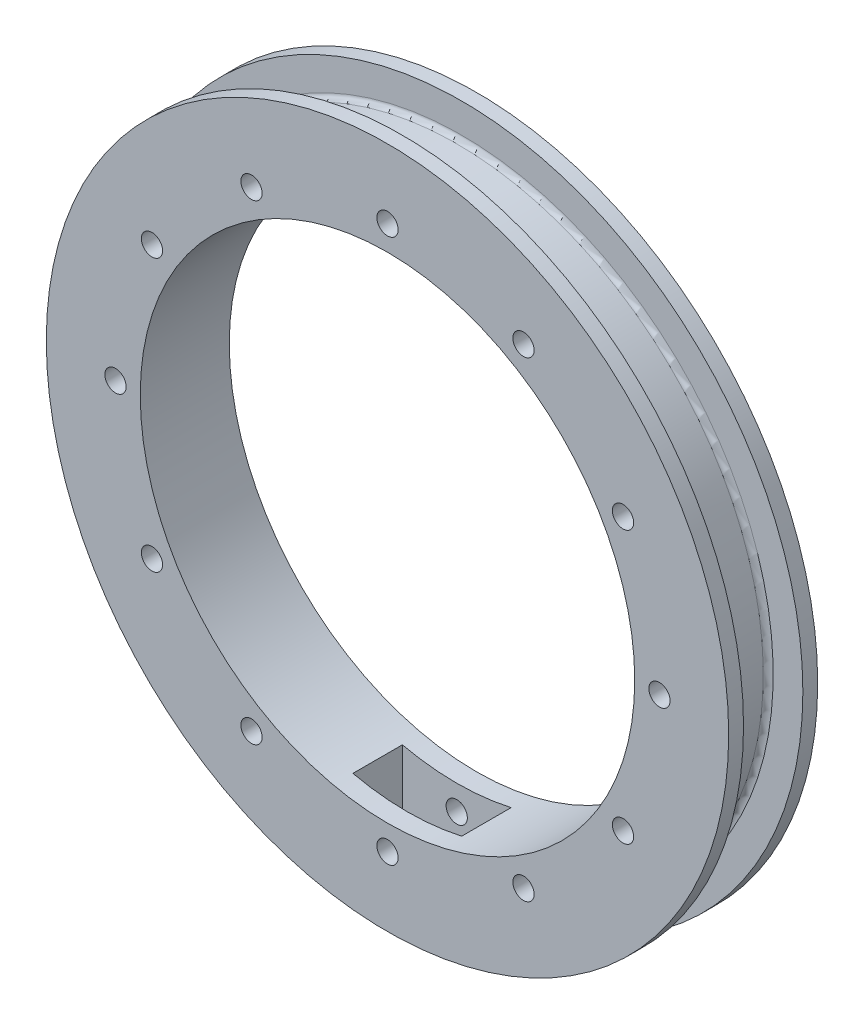
ISO-10303-21;
HEADER;
FILE_DESCRIPTION(('STEP AP214'),'2;1');
FILE_NAME('part.step','',(''),(''),'','','');
FILE_SCHEMA(('AUTOMOTIVE_DESIGN { 1 0 10303 214 1 1 1 1 }'));
ENDSEC;
DATA;
#1=APPLICATION_CONTEXT('core data for automotive mechanical design processes');
#2=APPLICATION_PROTOCOL_DEFINITION('international standard','automotive_design',2000,#1);
#3=PRODUCT_CONTEXT('',#1,'mechanical');
#4=PRODUCT('Part','Part','',(#3));
#5=PRODUCT_RELATED_PRODUCT_CATEGORY('part','',(#4));
#6=PRODUCT_DEFINITION_FORMATION('','',#4);
#7=PRODUCT_DEFINITION_CONTEXT('part definition',#1,'design');
#8=PRODUCT_DEFINITION('design','',#6,#7);
#9=PRODUCT_DEFINITION_SHAPE('','',#8);
#10=(LENGTH_UNIT() NAMED_UNIT(*) SI_UNIT(.MILLI.,.METRE.));
#11=(NAMED_UNIT(*) PLANE_ANGLE_UNIT() SI_UNIT($,.RADIAN.));
#12=(NAMED_UNIT(*) SI_UNIT($,.STERADIAN.) SOLID_ANGLE_UNIT());
#13=UNCERTAINTY_MEASURE_WITH_UNIT(LENGTH_MEASURE(1.E-05),#10,'distance_accuracy_value','');
#14=(GEOMETRIC_REPRESENTATION_CONTEXT(3) GLOBAL_UNCERTAINTY_ASSIGNED_CONTEXT((#13)) GLOBAL_UNIT_ASSIGNED_CONTEXT((#10,
#11,#12)) REPRESENTATION_CONTEXT('',''));
#15=CARTESIAN_POINT('',(0.,0.,0.));
#16=DIRECTION('',(0.,0.,1.));
#17=DIRECTION('',(1.,0.,0.));
#18=AXIS2_PLACEMENT_3D('',#15,#16,#17);
#19=CARTESIAN_POINT('',(0.,0.,6.));
#20=DIRECTION('',(0.,0.,-1.));
#21=DIRECTION('',(-1.,0.,0.));
#22=AXIS2_PLACEMENT_3D('',#19,#20,#21);
#23=CYLINDRICAL_SURFACE('',#22,62.);
#24=CARTESIAN_POINT('',(0.,0.,-5.));
#25=DIRECTION('',(0.,0.,-1.));
#26=DIRECTION('',(-1.,0.,0.));
#27=AXIS2_PLACEMENT_3D('',#24,#25,#26);
#28=CIRCLE('',#27,62.);
#29=CARTESIAN_POINT('',(11.,-61.0163912402973,-5.));
#30=VERTEX_POINT('',#29);
#31=CARTESIAN_POINT('',(-11.,-61.0163912403872,-5.));
#32=VERTEX_POINT('',#31);
#33=EDGE_CURVE('E118',#30,#32,#28,.F.);
#34=ORIENTED_EDGE('',*,*,#33,.T.);
#35=DIRECTION('',(0.,0.,-1.));
#36=VECTOR('',#35,1.);
#37=CARTESIAN_POINT('',(-11.,-61.0163912403872,6.));
#38=LINE('',#37,#36);
#39=CARTESIAN_POINT('',(-11.,-61.0163912403872,5.));
#40=VERTEX_POINT('',#39);
#41=EDGE_CURVE('E102',#32,#40,#38,.F.);
#42=ORIENTED_EDGE('',*,*,#41,.T.);
#43=CARTESIAN_POINT('',(0.,0.,5.));
#44=DIRECTION('',(0.,0.,1.));
#45=DIRECTION('',(1.,0.,0.));
#46=AXIS2_PLACEMENT_3D('',#43,#44,#45);
#47=CIRCLE('',#46,62.);
#48=CARTESIAN_POINT('',(11.,-61.0163912403872,5.));
#49=VERTEX_POINT('',#48);
#50=EDGE_CURVE('E114',#40,#49,#47,.F.);
#51=ORIENTED_EDGE('',*,*,#50,.T.);
#52=DIRECTION('',(0.,0.,-1.));
#53=VECTOR('',#52,1.);
#54=CARTESIAN_POINT('',(11.,-61.0163912403872,6.));
#55=LINE('',#54,#53);
#56=EDGE_CURVE('E99',#49,#30,#55,.T.);
#57=ORIENTED_EDGE('',*,*,#56,.T.);
#58=EDGE_LOOP('',(#34,#42,#51,#57));
#59=FACE_BOUND('',#58,.T.);
#60=ADVANCED_FACE('F34',(#59),#23,.T.);
#61=CARTESIAN_POINT('',(0.,0.,-9.));
#62=DIRECTION('',(0.,0.,1.));
#63=DIRECTION('',(1.,0.,0.));
#64=AXIS2_PLACEMENT_3D('',#61,#62,#63);
#65=CYLINDRICAL_SURFACE('',#64,69.);
#66=CARTESIAN_POINT('',(0.,0.,-9.));
#67=DIRECTION('',(0.,0.,-1.));
#68=DIRECTION('',(-1.,0.,0.));
#69=AXIS2_PLACEMENT_3D('',#66,#67,#68);
#70=CIRCLE('',#69,69.);
#71=CARTESIAN_POINT('',(-69.,0.,-9.));
#72=VERTEX_POINT('',#71);
#73=EDGE_CURVE('E111',#72,#72,#70,.T.);
#74=ORIENTED_EDGE('',*,*,#73,.F.);
#75=EDGE_LOOP('',(#74));
#76=FACE_BOUND('',#75,.T.);
#77=CARTESIAN_POINT('',(0.,0.,-6.));
#78=DIRECTION('',(0.,0.,-1.));
#79=DIRECTION('',(-1.,0.,0.));
#80=AXIS2_PLACEMENT_3D('',#77,#78,#79);
#81=CIRCLE('',#80,69.);
#82=CARTESIAN_POINT('',(-69.,0.,-6.));
#83=VERTEX_POINT('',#82);
#84=EDGE_CURVE('E108',#83,#83,#81,.T.);
#85=ORIENTED_EDGE('',*,*,#84,.T.);
#86=EDGE_LOOP('',(#85));
#87=FACE_BOUND('',#86,.T.);
#88=ADVANCED_FACE('F203',(#76,#87),#65,.T.);
#89=CARTESIAN_POINT('',(0.,0.,-9.));
#90=DIRECTION('',(0.,0.,-1.));
#91=DIRECTION('',(-1.,0.,0.));
#92=AXIS2_PLACEMENT_3D('',#89,#90,#91);
#93=PLANE('',#92);
#94=CARTESIAN_POINT('',(0.,55.,-9.));
#95=DIRECTION('',(0.,0.,-1.));
#96=DIRECTION('',(-1.,0.,0.));
#97=AXIS2_PLACEMENT_3D('',#94,#95,#96);
#98=CIRCLE('',#97,2.15);
#99=CARTESIAN_POINT('',(-2.15,55.,-9.));
#100=VERTEX_POINT('',#99);
#101=EDGE_CURVE('E130',#100,#100,#98,.T.);
#102=ORIENTED_EDGE('',*,*,#101,.F.);
#103=EDGE_LOOP('',(#102));
#104=FACE_BOUND('',#103,.T.);
#105=CARTESIAN_POINT('',(27.4999999999997,47.6313972081429,-9.));
#106=DIRECTION('',(0.,0.,-1.));
#107=DIRECTION('',(-1.,0.,0.));
#108=AXIS2_PLACEMENT_3D('',#105,#106,#107);
#109=CIRCLE('',#108,2.15000000000135);
#110=CARTESIAN_POINT('',(25.3499999999984,47.6313972081429,-9.));
#111=VERTEX_POINT('',#110);
#112=EDGE_CURVE('E302',#111,#111,#109,.T.);
#113=ORIENTED_EDGE('',*,*,#112,.F.);
#114=EDGE_LOOP('',(#113));
#115=FACE_BOUND('',#114,.T.);
#116=CARTESIAN_POINT('',(47.631397208143,27.4999999999979,-9.));
#117=DIRECTION('',(0.,0.,-1.));
#118=DIRECTION('',(-1.,0.,0.));
#119=AXIS2_PLACEMENT_3D('',#116,#117,#118);
#120=CIRCLE('',#119,2.15000000000237);
#121=CARTESIAN_POINT('',(45.4813972081406,27.4999999999979,-9.));
#122=VERTEX_POINT('',#121);
#123=EDGE_CURVE('E299',#122,#122,#120,.T.);
#124=ORIENTED_EDGE('',*,*,#123,.F.);
#125=EDGE_LOOP('',(#124));
#126=FACE_BOUND('',#125,.T.);
#127=CARTESIAN_POINT('',(54.9999999999977,-2.34142324931068E-12,-9.));
#128=DIRECTION('',(0.,0.,-1.));
#129=DIRECTION('',(-1.,0.,0.));
#130=AXIS2_PLACEMENT_3D('',#127,#128,#129);
#131=CIRCLE('',#130,2.15000000000347);
#132=CARTESIAN_POINT('',(52.8499999999942,-2.34142324931068E-12,-9.));
#133=VERTEX_POINT('',#132);
#134=EDGE_CURVE('E295',#133,#133,#131,.T.);
#135=ORIENTED_EDGE('',*,*,#134,.F.);
#136=EDGE_LOOP('',(#135));
#137=FACE_BOUND('',#136,.T.);
#138=CARTESIAN_POINT('',(-27.5000000000001,47.6313972081441,-9.));
#139=DIRECTION('',(0.,0.,-1.));
#140=DIRECTION('',(-1.,0.,0.));
#141=AXIS2_PLACEMENT_3D('',#138,#139,#140);
#142=CIRCLE('',#141,2.15);
#143=CARTESIAN_POINT('',(-29.6500000000001,47.6313972081441,-9.));
#144=VERTEX_POINT('',#143);
#145=EDGE_CURVE('E289',#144,#144,#142,.T.);
#146=ORIENTED_EDGE('',*,*,#145,.F.);
#147=EDGE_LOOP('',(#146));
#148=FACE_BOUND('',#147,.T.);
#149=CARTESIAN_POINT('',(-47.6313972081453,27.500000000002,-9.));
#150=DIRECTION('',(0.,0.,-1.));
#151=DIRECTION('',(-1.,0.,0.));
#152=AXIS2_PLACEMENT_3D('',#149,#150,#151);
#153=CIRCLE('',#152,2.15000000000064);
#154=CARTESIAN_POINT('',(-49.7813972081459,27.500000000002,-9.));
#155=VERTEX_POINT('',#154);
#156=EDGE_CURVE('E292',#155,#155,#153,.T.);
#157=ORIENTED_EDGE('',*,*,#156,.F.);
#158=EDGE_LOOP('',(#157));
#159=FACE_BOUND('',#158,.T.);
#160=CARTESIAN_POINT('',(-55.0000000000023,2.33468769191537E-12,-9.));
#161=DIRECTION('',(0.,0.,-1.));
#162=DIRECTION('',(-1.,0.,0.));
#163=AXIS2_PLACEMENT_3D('',#160,#161,#162);
#164=CIRCLE('',#163,2.15000000000173);
#165=CARTESIAN_POINT('',(-57.1500000000041,2.33468769191537E-12,-9.));
#166=VERTEX_POINT('',#165);
#167=EDGE_CURVE('E319',#166,#166,#164,.T.);
#168=ORIENTED_EDGE('',*,*,#167,.F.);
#169=EDGE_LOOP('',(#168));
#170=FACE_BOUND('',#169,.T.);
#171=CARTESIAN_POINT('',(-47.6313972081476,-27.499999999998,-9.));
#172=DIRECTION('',(0.,0.,-1.));
#173=DIRECTION('',(-1.,0.,0.));
#174=AXIS2_PLACEMENT_3D('',#171,#172,#173);
#175=CIRCLE('',#174,2.15000000000301);
#176=CARTESIAN_POINT('',(-49.7813972081506,-27.499999999998,-9.));
#177=VERTEX_POINT('',#176);
#178=EDGE_CURVE('E308',#177,#177,#175,.T.);
#179=ORIENTED_EDGE('',*,*,#178,.F.);
#180=EDGE_LOOP('',(#179));
#181=FACE_BOUND('',#180,.T.);
#182=CARTESIAN_POINT('',(-27.5000000000044,-47.6313972081429,-9.));
#183=DIRECTION('',(0.,0.,-1.));
#184=DIRECTION('',(-1.,0.,0.));
#185=AXIS2_PLACEMENT_3D('',#182,#183,#184);
#186=CIRCLE('',#185,2.15000000000414);
#187=CARTESIAN_POINT('',(-29.6500000000085,-47.6313972081429,-9.));
#188=VERTEX_POINT('',#187);
#189=EDGE_CURVE('E305',#188,#188,#186,.T.);
#190=ORIENTED_EDGE('',*,*,#189,.F.);
#191=EDGE_LOOP('',(#190));
#192=FACE_BOUND('',#191,.T.);
#193=CARTESIAN_POINT('',(-4.66937538383073E-12,-55.,-9.));
#194=DIRECTION('',(0.,0.,-1.));
#195=DIRECTION('',(-1.,0.,0.));
#196=AXIS2_PLACEMENT_3D('',#193,#194,#195);
#197=CIRCLE('',#196,2.15000000000483);
#198=CARTESIAN_POINT('',(-2.1500000000095,-55.,-9.));
#199=VERTEX_POINT('',#198);
#200=EDGE_CURVE('E309',#199,#199,#197,.T.);
#201=ORIENTED_EDGE('',*,*,#200,.F.);
#202=EDGE_LOOP('',(#201));
#203=FACE_BOUND('',#202,.T.);
#204=CARTESIAN_POINT('',(27.4999999999956,-47.6313972081453,-9.));
#205=DIRECTION('',(0.,0.,-1.));
#206=DIRECTION('',(-1.,0.,0.));
#207=AXIS2_PLACEMENT_3D('',#204,#205,#206);
#208=CIRCLE('',#207,2.15000000000495);
#209=CARTESIAN_POINT('',(25.3499999999907,-47.6313972081453,-9.));
#210=VERTEX_POINT('',#209);
#211=EDGE_CURVE('E312',#210,#210,#208,.T.);
#212=ORIENTED_EDGE('',*,*,#211,.F.);
#213=EDGE_LOOP('',(#212));
#214=FACE_BOUND('',#213,.T.);
#215=CARTESIAN_POINT('',(47.6313972081406,-27.500000000002,-9.));
#216=DIRECTION('',(0.,0.,-1.));
#217=DIRECTION('',(-1.,0.,0.));
#218=AXIS2_PLACEMENT_3D('',#215,#216,#217);
#219=CIRCLE('',#218,2.15000000000445);
#220=CARTESIAN_POINT('',(45.4813972081362,-27.500000000002,-9.));
#221=VERTEX_POINT('',#220);
#222=EDGE_CURVE('E298',#221,#221,#219,.T.);
#223=ORIENTED_EDGE('',*,*,#222,.F.);
#224=EDGE_LOOP('',(#223));
#225=FACE_BOUND('',#224,.T.);
#226=CARTESIAN_POINT('',(0.,0.,-9.));
#227=DIRECTION('',(0.,0.,-1.));
#228=DIRECTION('',(-1.,0.,0.));
#229=AXIS2_PLACEMENT_3D('',#226,#227,#228);
#230=CIRCLE('',#229,50.);
#231=CARTESIAN_POINT('',(-50.,0.,-9.));
#232=VERTEX_POINT('',#231);
#233=EDGE_CURVE('E163',#232,#232,#230,.T.);
#234=ORIENTED_EDGE('',*,*,#233,.F.);
#235=EDGE_LOOP('',(#234));
#236=FACE_BOUND('',#235,.T.);
#237=ORIENTED_EDGE('',*,*,#73,.T.);
#238=EDGE_LOOP('',(#237));
#239=FACE_BOUND('',#238,.T.);
#240=ADVANCED_FACE('F207',(#104,#115,#126,#137,#148,#159,#170,#181,#192,#203,#214,#225,#236,
#239),#93,.T.);
#241=CARTESIAN_POINT('',(0.,0.,-6.));
#242=DIRECTION('',(0.,0.,-1.));
#243=DIRECTION('',(-1.,0.,0.));
#244=AXIS2_PLACEMENT_3D('',#241,#242,#243);
#245=PLANE('',#244);
#246=CARTESIAN_POINT('',(0.,0.,-6.));
#247=DIRECTION('',(0.,0.,-1.));
#248=DIRECTION('',(-1.,0.,0.));
#249=AXIS2_PLACEMENT_3D('',#246,#247,#248);
#250=CIRCLE('',#249,63.);
#251=CARTESIAN_POINT('',(-63.,0.,-6.));
#252=VERTEX_POINT('',#251);
#253=EDGE_CURVE('E121',#252,#252,#250,.T.);
#254=ORIENTED_EDGE('',*,*,#253,.T.);
#255=EDGE_LOOP('',(#254));
#256=FACE_BOUND('',#255,.T.);
#257=ORIENTED_EDGE('',*,*,#84,.F.);
#258=EDGE_LOOP('',(#257));
#259=FACE_BOUND('',#258,.T.);
#260=ADVANCED_FACE('F211',(#256,#259),#245,.F.);
#261=CARTESIAN_POINT('',(0.,0.,9.));
#262=DIRECTION('',(0.,0.,-1.));
#263=DIRECTION('',(-1.,0.,0.));
#264=AXIS2_PLACEMENT_3D('',#261,#262,#263);
#265=CYLINDRICAL_SURFACE('',#264,69.);
#266=CARTESIAN_POINT('',(0.,0.,9.));
#267=DIRECTION('',(0.,0.,1.));
#268=DIRECTION('',(1.,0.,0.));
#269=AXIS2_PLACEMENT_3D('',#266,#267,#268);
#270=CIRCLE('',#269,69.);
#271=CARTESIAN_POINT('',(69.,0.,9.));
#272=VERTEX_POINT('',#271);
#273=EDGE_CURVE('E105',#272,#272,#270,.T.);
#274=ORIENTED_EDGE('',*,*,#273,.F.);
#275=EDGE_LOOP('',(#274));
#276=FACE_BOUND('',#275,.T.);
#277=CARTESIAN_POINT('',(0.,0.,6.));
#278=DIRECTION('',(0.,0.,1.));
#279=DIRECTION('',(1.,0.,0.));
#280=AXIS2_PLACEMENT_3D('',#277,#278,#279);
#281=CIRCLE('',#280,69.);
#282=CARTESIAN_POINT('',(69.,0.,6.));
#283=VERTEX_POINT('',#282);
#284=EDGE_CURVE('E104',#283,#283,#281,.T.);
#285=ORIENTED_EDGE('',*,*,#284,.T.);
#286=EDGE_LOOP('',(#285));
#287=FACE_BOUND('',#286,.T.);
#288=ADVANCED_FACE('F214',(#276,#287),#265,.T.);
#289=CARTESIAN_POINT('',(0.,0.,9.));
#290=DIRECTION('',(0.,0.,1.));
#291=DIRECTION('',(1.,0.,0.));
#292=AXIS2_PLACEMENT_3D('',#289,#290,#291);
#293=PLANE('',#292);
#294=CARTESIAN_POINT('',(0.,55.,9.00000000000001));
#295=DIRECTION('',(0.,0.,1.));
#296=DIRECTION('',(1.,0.,0.));
#297=AXIS2_PLACEMENT_3D('',#294,#295,#296);
#298=CIRCLE('',#297,2.15);
#299=CARTESIAN_POINT('',(2.15,55.,9.00000000000001));
#300=VERTEX_POINT('',#299);
#301=EDGE_CURVE('E38',#300,#300,#298,.T.);
#302=ORIENTED_EDGE('',*,*,#301,.F.);
#303=EDGE_LOOP('',(#302));
#304=FACE_BOUND('',#303,.T.);
#305=CARTESIAN_POINT('',(27.4999999999997,47.6313972081429,9.00000000000001));
#306=DIRECTION('',(0.,0.,1.));
#307=DIRECTION('',(1.,0.,0.));
#308=AXIS2_PLACEMENT_3D('',#305,#306,#307);
#309=CIRCLE('',#308,2.15000000000135);
#310=CARTESIAN_POINT('',(29.6500000000011,47.6313972081429,9.00000000000001));
#311=VERTEX_POINT('',#310);
#312=EDGE_CURVE('E158',#311,#311,#309,.T.);
#313=ORIENTED_EDGE('',*,*,#312,.F.);
#314=EDGE_LOOP('',(#313));
#315=FACE_BOUND('',#314,.T.);
#316=CARTESIAN_POINT('',(47.631397208143,27.4999999999979,9.00000000000001));
#317=DIRECTION('',(0.,0.,1.));
#318=DIRECTION('',(1.,0.,0.));
#319=AXIS2_PLACEMENT_3D('',#316,#317,#318);
#320=CIRCLE('',#319,2.15000000000237);
#321=CARTESIAN_POINT('',(49.7813972081453,27.4999999999979,9.00000000000001));
#322=VERTEX_POINT('',#321);
#323=EDGE_CURVE('E156',#322,#322,#320,.T.);
#324=ORIENTED_EDGE('',*,*,#323,.F.);
#325=EDGE_LOOP('',(#324));
#326=FACE_BOUND('',#325,.T.);
#327=CARTESIAN_POINT('',(54.9999999999977,-2.34142324931068E-12,9.00000000000001));
#328=DIRECTION('',(0.,0.,1.));
#329=DIRECTION('',(1.,0.,0.));
#330=AXIS2_PLACEMENT_3D('',#327,#328,#329);
#331=CIRCLE('',#330,2.15000000000347);
#332=CARTESIAN_POINT('',(57.1500000000011,-2.34142324931068E-12,9.00000000000001));
#333=VERTEX_POINT('',#332);
#334=EDGE_CURVE('E153',#333,#333,#331,.T.);
#335=ORIENTED_EDGE('',*,*,#334,.F.);
#336=EDGE_LOOP('',(#335));
#337=FACE_BOUND('',#336,.T.);
#338=CARTESIAN_POINT('',(-27.5000000000001,47.6313972081441,9.00000000000001));
#339=DIRECTION('',(0.,0.,1.));
#340=DIRECTION('',(1.,0.,0.));
#341=AXIS2_PLACEMENT_3D('',#338,#339,#340);
#342=CIRCLE('',#341,2.15);
#343=CARTESIAN_POINT('',(-25.3500000000001,47.6313972081441,9.00000000000001));
#344=VERTEX_POINT('',#343);
#345=EDGE_CURVE('E150',#344,#344,#342,.T.);
#346=ORIENTED_EDGE('',*,*,#345,.F.);
#347=EDGE_LOOP('',(#346));
#348=FACE_BOUND('',#347,.T.);
#349=CARTESIAN_POINT('',(-47.6313972081453,27.500000000002,9.00000000000001));
#350=DIRECTION('',(0.,0.,1.));
#351=DIRECTION('',(1.,0.,0.));
#352=AXIS2_PLACEMENT_3D('',#349,#350,#351);
#353=CIRCLE('',#352,2.15000000000064);
#354=CARTESIAN_POINT('',(-45.4813972081447,27.500000000002,9.00000000000001));
#355=VERTEX_POINT('',#354);
#356=EDGE_CURVE('E147',#355,#355,#353,.T.);
#357=ORIENTED_EDGE('',*,*,#356,.F.);
#358=EDGE_LOOP('',(#357));
#359=FACE_BOUND('',#358,.T.);
#360=CARTESIAN_POINT('',(-55.0000000000023,2.33468769191537E-12,9.00000000000001));
#361=DIRECTION('',(0.,0.,1.));
#362=DIRECTION('',(1.,0.,0.));
#363=AXIS2_PLACEMENT_3D('',#360,#361,#362);
#364=CIRCLE('',#363,2.15000000000173);
#365=CARTESIAN_POINT('',(-52.8500000000006,2.33468769191537E-12,9.00000000000001));
#366=VERTEX_POINT('',#365);
#367=EDGE_CURVE('E144',#366,#366,#364,.T.);
#368=ORIENTED_EDGE('',*,*,#367,.F.);
#369=EDGE_LOOP('',(#368));
#370=FACE_BOUND('',#369,.T.);
#371=CARTESIAN_POINT('',(-47.6313972081476,-27.499999999998,9.00000000000001));
#372=DIRECTION('',(0.,0.,1.));
#373=DIRECTION('',(1.,0.,0.));
#374=AXIS2_PLACEMENT_3D('',#371,#372,#373);
#375=CIRCLE('',#374,2.15000000000301);
#376=CARTESIAN_POINT('',(-45.4813972081446,-27.499999999998,9.00000000000001));
#377=VERTEX_POINT('',#376);
#378=EDGE_CURVE('E141',#377,#377,#375,.T.);
#379=ORIENTED_EDGE('',*,*,#378,.F.);
#380=EDGE_LOOP('',(#379));
#381=FACE_BOUND('',#380,.T.);
#382=CARTESIAN_POINT('',(-27.5000000000044,-47.6313972081429,9.00000000000001));
#383=DIRECTION('',(0.,0.,1.));
#384=DIRECTION('',(1.,0.,0.));
#385=AXIS2_PLACEMENT_3D('',#382,#383,#384);
#386=CIRCLE('',#385,2.15000000000414);
#387=CARTESIAN_POINT('',(-25.3500000000002,-47.6313972081429,9.00000000000001));
#388=VERTEX_POINT('',#387);
#389=EDGE_CURVE('E138',#388,#388,#386,.T.);
#390=ORIENTED_EDGE('',*,*,#389,.F.);
#391=EDGE_LOOP('',(#390));
#392=FACE_BOUND('',#391,.T.);
#393=CARTESIAN_POINT('',(-4.66937538383073E-12,-55.,9.00000000000001));
#394=DIRECTION('',(0.,0.,1.));
#395=DIRECTION('',(1.,0.,0.));
#396=AXIS2_PLACEMENT_3D('',#393,#394,#395);
#397=CIRCLE('',#396,2.15000000000483);
#398=CARTESIAN_POINT('',(2.15000000000016,-55.,9.00000000000001));
#399=VERTEX_POINT('',#398);
#400=EDGE_CURVE('E135',#399,#399,#397,.T.);
#401=ORIENTED_EDGE('',*,*,#400,.F.);
#402=EDGE_LOOP('',(#401));
#403=FACE_BOUND('',#402,.T.);
#404=CARTESIAN_POINT('',(27.4999999999956,-47.6313972081453,9.00000000000001));
#405=DIRECTION('',(0.,0.,1.));
#406=DIRECTION('',(1.,0.,0.));
#407=AXIS2_PLACEMENT_3D('',#404,#405,#406);
#408=CIRCLE('',#407,2.15000000000495);
#409=CARTESIAN_POINT('',(29.6500000000006,-47.6313972081453,9.00000000000001));
#410=VERTEX_POINT('',#409);
#411=EDGE_CURVE('E134',#410,#410,#408,.T.);
#412=ORIENTED_EDGE('',*,*,#411,.F.);
#413=EDGE_LOOP('',(#412));
#414=FACE_BOUND('',#413,.T.);
#415=CARTESIAN_POINT('',(47.6313972081406,-27.500000000002,9.00000000000001));
#416=DIRECTION('',(0.,0.,1.));
#417=DIRECTION('',(1.,0.,0.));
#418=AXIS2_PLACEMENT_3D('',#415,#416,#417);
#419=CIRCLE('',#418,2.15000000000445);
#420=CARTESIAN_POINT('',(49.7813972081451,-27.500000000002,9.00000000000001));
#421=VERTEX_POINT('',#420);
#422=EDGE_CURVE('E131',#421,#421,#419,.T.);
#423=ORIENTED_EDGE('',*,*,#422,.F.);
#424=EDGE_LOOP('',(#423));
#425=FACE_BOUND('',#424,.T.);
#426=CARTESIAN_POINT('',(0.,0.,9.00000000000001));
#427=DIRECTION('',(0.,0.,1.));
#428=DIRECTION('',(1.,0.,0.));
#429=AXIS2_PLACEMENT_3D('',#426,#427,#428);
#430=CIRCLE('',#429,50.);
#431=CARTESIAN_POINT('',(50.,0.,9.00000000000001));
#432=VERTEX_POINT('',#431);
#433=EDGE_CURVE('E91',#432,#432,#430,.T.);
#434=ORIENTED_EDGE('',*,*,#433,.F.);
#435=EDGE_LOOP('',(#434));
#436=FACE_BOUND('',#435,.T.);
#437=ORIENTED_EDGE('',*,*,#273,.T.);
#438=EDGE_LOOP('',(#437));
#439=FACE_BOUND('',#438,.T.);
#440=ADVANCED_FACE('F197',(#304,#315,#326,#337,#348,#359,#370,#381,#392,#403,#414,#425,#436,
#439),#293,.T.);
#441=CARTESIAN_POINT('',(0.,0.,6.));
#442=DIRECTION('',(0.,0.,1.));
#443=DIRECTION('',(1.,0.,0.));
#444=AXIS2_PLACEMENT_3D('',#441,#442,#443);
#445=PLANE('',#444);
#446=CARTESIAN_POINT('',(0.,0.,6.));
#447=DIRECTION('',(0.,0.,1.));
#448=DIRECTION('',(1.,0.,0.));
#449=AXIS2_PLACEMENT_3D('',#446,#447,#448);
#450=CIRCLE('',#449,63.);
#451=CARTESIAN_POINT('',(63.,0.,6.));
#452=VERTEX_POINT('',#451);
#453=EDGE_CURVE('E43',#452,#452,#450,.T.);
#454=ORIENTED_EDGE('',*,*,#453,.T.);
#455=EDGE_LOOP('',(#454));
#456=FACE_BOUND('',#455,.T.);
#457=ORIENTED_EDGE('',*,*,#284,.F.);
#458=EDGE_LOOP('',(#457));
#459=FACE_BOUND('',#458,.T.);
#460=ADVANCED_FACE('F190',(#456,#459),#445,.F.);
#461=CARTESIAN_POINT('',(0.,0.,-5.));
#462=DIRECTION('',(0.,0.,-1.));
#463=DIRECTION('',(-1.,0.,0.));
#464=AXIS2_PLACEMENT_3D('',#461,#462,#463);
#465=TOROIDAL_SURFACE('',#464,63.,1.);
#466=ORIENTED_EDGE('',*,*,#253,.F.);
#467=EDGE_LOOP('',(#466));
#468=FACE_BOUND('',#467,.T.);
#469=EDGE_CURVE('E119',#32,#30,#28,.F.);
#470=ORIENTED_EDGE('',*,*,#469,.F.);
#471=ORIENTED_EDGE('',*,*,#33,.F.);
#472=EDGE_LOOP('',(#470,#471));
#473=FACE_BOUND('',#472,.T.);
#474=ADVANCED_FACE('F188',(#468,#473),#465,.F.);
#475=CARTESIAN_POINT('',(0.,0.,5.));
#476=DIRECTION('',(0.,0.,1.));
#477=DIRECTION('',(1.,0.,0.));
#478=AXIS2_PLACEMENT_3D('',#475,#476,#477);
#479=TOROIDAL_SURFACE('',#478,63.,1.);
#480=EDGE_CURVE('E90',#49,#40,#47,.F.);
#481=ORIENTED_EDGE('',*,*,#480,.F.);
#482=ORIENTED_EDGE('',*,*,#50,.F.);
#483=EDGE_LOOP('',(#481,#482));
#484=FACE_BOUND('',#483,.T.);
#485=ORIENTED_EDGE('',*,*,#453,.F.);
#486=EDGE_LOOP('',(#485));
#487=FACE_BOUND('',#486,.T.);
#488=ADVANCED_FACE('F36',(#484,#487),#479,.F.);
#489=CARTESIAN_POINT('',(11.,-133.,-5.));
#490=DIRECTION('',(0.,0.,-1.));
#491=DIRECTION('',(-1.,0.,0.));
#492=AXIS2_PLACEMENT_3D('',#489,#490,#491);
#493=PLANE('',#492);
#494=CARTESIAN_POINT('',(-4.66937538383073E-12,-55.,-5.));
#495=DIRECTION('',(0.,0.,-1.));
#496=DIRECTION('',(-1.,0.,0.));
#497=AXIS2_PLACEMENT_3D('',#494,#495,#496);
#498=CIRCLE('',#497,2.15000000000483);
#499=CARTESIAN_POINT('',(-2.1500000000095,-55.,-5.));
#500=VERTEX_POINT('',#499);
#501=EDGE_CURVE('E129',#500,#500,#498,.T.);
#502=ORIENTED_EDGE('',*,*,#501,.T.);
#503=EDGE_LOOP('',(#502));
#504=FACE_BOUND('',#503,.T.);
#505=DIRECTION('',(0.,1.,0.));
#506=VECTOR('',#505,1.);
#507=CARTESIAN_POINT('',(11.,-133.,-5.));
#508=LINE('',#507,#506);
#509=CARTESIAN_POINT('',(11.,-48.7749935930289,-5.));
#510=VERTEX_POINT('',#509);
#511=EDGE_CURVE('E93',#30,#510,#508,.T.);
#512=ORIENTED_EDGE('',*,*,#511,.T.);
#513=CARTESIAN_POINT('',(0.,0.,-5.));
#514=DIRECTION('',(0.,0.,-1.));
#515=DIRECTION('',(-1.,0.,0.));
#516=AXIS2_PLACEMENT_3D('',#513,#514,#515);
#517=CIRCLE('',#516,50.);
#518=CARTESIAN_POINT('',(-11.,-48.7749935930289,-5.));
#519=VERTEX_POINT('',#518);
#520=EDGE_CURVE('E86',#510,#519,#517,.T.);
#521=ORIENTED_EDGE('',*,*,#520,.T.);
#522=DIRECTION('',(0.,1.,0.));
#523=VECTOR('',#522,1.);
#524=CARTESIAN_POINT('',(-11.,-133.,-5.));
#525=LINE('',#524,#523);
#526=EDGE_CURVE('E85',#32,#519,#525,.T.);
#527=ORIENTED_EDGE('',*,*,#526,.F.);
#528=ORIENTED_EDGE('',*,*,#469,.T.);
#529=EDGE_LOOP('',(#512,#521,#527,#528));
#530=FACE_BOUND('',#529,.T.);
#531=ADVANCED_FACE('F178',(#504,#530),#493,.F.);
#532=CARTESIAN_POINT('',(-11.,-133.,5.));
#533=DIRECTION('',(-1.,0.,0.));
#534=DIRECTION('',(0.,0.,1.));
#535=AXIS2_PLACEMENT_3D('',#532,#533,#534);
#536=PLANE('',#535);
#537=ORIENTED_EDGE('',*,*,#526,.T.);
#538=DIRECTION('',(0.,0.,-1.));
#539=VECTOR('',#538,1.);
#540=CARTESIAN_POINT('',(-11.,-48.7749935930289,124.));
#541=LINE('',#540,#539);
#542=CARTESIAN_POINT('',(-11.,-48.7749935930289,5.));
#543=VERTEX_POINT('',#542);
#544=EDGE_CURVE('E75',#519,#543,#541,.F.);
#545=ORIENTED_EDGE('',*,*,#544,.T.);
#546=DIRECTION('',(0.,1.,0.));
#547=VECTOR('',#546,1.);
#548=CARTESIAN_POINT('',(-11.,-133.,5.));
#549=LINE('',#548,#547);
#550=EDGE_CURVE('E82',#40,#543,#549,.T.);
#551=ORIENTED_EDGE('',*,*,#550,.F.);
#552=ORIENTED_EDGE('',*,*,#41,.F.);
#553=EDGE_LOOP('',(#537,#545,#551,#552));
#554=FACE_BOUND('',#553,.T.);
#555=ADVANCED_FACE('F81',(#554),#536,.F.);
#556=CARTESIAN_POINT('',(11.,-133.,5.));
#557=DIRECTION('',(1.,0.,0.));
#558=DIRECTION('',(0.,0.,-1.));
#559=AXIS2_PLACEMENT_3D('',#556,#557,#558);
#560=PLANE('',#559);
#561=DIRECTION('',(0.,1.,0.));
#562=VECTOR('',#561,1.);
#563=CARTESIAN_POINT('',(11.,-133.,5.));
#564=LINE('',#563,#562);
#565=CARTESIAN_POINT('',(11.,-48.7749935930289,5.));
#566=VERTEX_POINT('',#565);
#567=EDGE_CURVE('E57',#49,#566,#564,.T.);
#568=ORIENTED_EDGE('',*,*,#567,.T.);
#569=DIRECTION('',(0.,0.,-1.));
#570=VECTOR('',#569,1.);
#571=CARTESIAN_POINT('',(11.,-48.7749935930289,124.));
#572=LINE('',#571,#570);
#573=EDGE_CURVE('E51',#566,#510,#572,.T.);
#574=ORIENTED_EDGE('',*,*,#573,.T.);
#575=ORIENTED_EDGE('',*,*,#511,.F.);
#576=ORIENTED_EDGE('',*,*,#56,.F.);
#577=EDGE_LOOP('',(#568,#574,#575,#576));
#578=FACE_BOUND('',#577,.T.);
#579=ADVANCED_FACE('F181',(#578),#560,.F.);
#580=CARTESIAN_POINT('',(11.,-133.,5.));
#581=DIRECTION('',(0.,0.,1.));
#582=DIRECTION('',(1.,0.,0.));
#583=AXIS2_PLACEMENT_3D('',#580,#581,#582);
#584=PLANE('',#583);
#585=CARTESIAN_POINT('',(-4.66937538383073E-12,-55.,5.));
#586=DIRECTION('',(0.,0.,1.));
#587=DIRECTION('',(1.,0.,0.));
#588=AXIS2_PLACEMENT_3D('',#585,#586,#587);
#589=CIRCLE('',#588,2.15000000000483);
#590=CARTESIAN_POINT('',(2.15000000000016,-55.,5.));
#591=VERTEX_POINT('',#590);
#592=EDGE_CURVE('E126',#591,#591,#589,.T.);
#593=ORIENTED_EDGE('',*,*,#592,.T.);
#594=EDGE_LOOP('',(#593));
#595=FACE_BOUND('',#594,.T.);
#596=ORIENTED_EDGE('',*,*,#550,.T.);
#597=CARTESIAN_POINT('',(0.,0.,5.));
#598=DIRECTION('',(0.,0.,1.));
#599=DIRECTION('',(1.,0.,0.));
#600=AXIS2_PLACEMENT_3D('',#597,#598,#599);
#601=CIRCLE('',#600,50.);
#602=EDGE_CURVE('E11',#543,#566,#601,.T.);
#603=ORIENTED_EDGE('',*,*,#602,.T.);
#604=ORIENTED_EDGE('',*,*,#567,.F.);
#605=ORIENTED_EDGE('',*,*,#480,.T.);
#606=EDGE_LOOP('',(#596,#603,#604,#605));
#607=FACE_BOUND('',#606,.T.);
#608=ADVANCED_FACE('F88',(#595,#607),#584,.F.);
#609=CARTESIAN_POINT('',(0.,0.,124.));
#610=DIRECTION('',(0.,0.,-1.));
#611=DIRECTION('',(-1.,0.,0.));
#612=AXIS2_PLACEMENT_3D('',#609,#610,#611);
#613=CYLINDRICAL_SURFACE('',#612,50.);
#614=ORIENTED_EDGE('',*,*,#433,.T.);
#615=EDGE_LOOP('',(#614));
#616=FACE_BOUND('',#615,.T.);
#617=ORIENTED_EDGE('',*,*,#233,.T.);
#618=EDGE_LOOP('',(#617));
#619=FACE_BOUND('',#618,.T.);
#620=ORIENTED_EDGE('',*,*,#573,.F.);
#621=ORIENTED_EDGE('',*,*,#602,.F.);
#622=ORIENTED_EDGE('',*,*,#544,.F.);
#623=ORIENTED_EDGE('',*,*,#520,.F.);
#624=EDGE_LOOP('',(#620,#621,#622,#623));
#625=FACE_BOUND('',#624,.T.);
#626=ADVANCED_FACE('F74',(#616,#619,#625),#613,.F.);
#627=CARTESIAN_POINT('',(-4.66937538383073E-12,-55.,124.));
#628=DIRECTION('',(0.,0.,-1.));
#629=DIRECTION('',(-1.,0.,0.));
#630=AXIS2_PLACEMENT_3D('',#627,#628,#629);
#631=CYLINDRICAL_SURFACE('',#630,2.15000000000483);
#632=ORIENTED_EDGE('',*,*,#400,.T.);
#633=EDGE_LOOP('',(#632));
#634=FACE_BOUND('',#633,.T.);
#635=ORIENTED_EDGE('',*,*,#592,.F.);
#636=EDGE_LOOP('',(#635));
#637=FACE_BOUND('',#636,.T.);
#638=ADVANCED_FACE('F237',(#634,#637),#631,.F.);
#639=ORIENTED_EDGE('',*,*,#200,.T.);
#640=EDGE_LOOP('',(#639));
#641=FACE_BOUND('',#640,.T.);
#642=ORIENTED_EDGE('',*,*,#501,.F.);
#643=EDGE_LOOP('',(#642));
#644=FACE_BOUND('',#643,.T.);
#645=ADVANCED_FACE('F261',(#641,#644),#631,.F.);
#646=CARTESIAN_POINT('',(47.6313972081406,-27.500000000002,124.));
#647=DIRECTION('',(0.,0.,-1.));
#648=DIRECTION('',(-1.,0.,0.));
#649=AXIS2_PLACEMENT_3D('',#646,#647,#648);
#650=CYLINDRICAL_SURFACE('',#649,2.15000000000445);
#651=ORIENTED_EDGE('',*,*,#422,.T.);
#652=EDGE_LOOP('',(#651));
#653=FACE_BOUND('',#652,.T.);
#654=ORIENTED_EDGE('',*,*,#222,.T.);
#655=EDGE_LOOP('',(#654));
#656=FACE_BOUND('',#655,.T.);
#657=ADVANCED_FACE('F257',(#653,#656),#650,.F.);
#658=CARTESIAN_POINT('',(27.4999999999956,-47.6313972081453,124.));
#659=DIRECTION('',(0.,0.,-1.));
#660=DIRECTION('',(-1.,0.,0.));
#661=AXIS2_PLACEMENT_3D('',#658,#659,#660);
#662=CYLINDRICAL_SURFACE('',#661,2.15000000000495);
#663=ORIENTED_EDGE('',*,*,#411,.T.);
#664=EDGE_LOOP('',(#663));
#665=FACE_BOUND('',#664,.T.);
#666=ORIENTED_EDGE('',*,*,#211,.T.);
#667=EDGE_LOOP('',(#666));
#668=FACE_BOUND('',#667,.T.);
#669=ADVANCED_FACE('F260',(#665,#668),#662,.F.);
#670=CARTESIAN_POINT('',(-27.5000000000044,-47.6313972081429,124.));
#671=DIRECTION('',(0.,0.,-1.));
#672=DIRECTION('',(-1.,0.,0.));
#673=AXIS2_PLACEMENT_3D('',#670,#671,#672);
#674=CYLINDRICAL_SURFACE('',#673,2.15000000000414);
#675=ORIENTED_EDGE('',*,*,#389,.T.);
#676=EDGE_LOOP('',(#675));
#677=FACE_BOUND('',#676,.T.);
#678=ORIENTED_EDGE('',*,*,#189,.T.);
#679=EDGE_LOOP('',(#678));
#680=FACE_BOUND('',#679,.T.);
#681=ADVANCED_FACE('F243',(#677,#680),#674,.F.);
#682=CARTESIAN_POINT('',(-47.6313972081476,-27.499999999998,124.));
#683=DIRECTION('',(0.,0.,-1.));
#684=DIRECTION('',(-1.,0.,0.));
#685=AXIS2_PLACEMENT_3D('',#682,#683,#684);
#686=CYLINDRICAL_SURFACE('',#685,2.15000000000301);
#687=ORIENTED_EDGE('',*,*,#378,.T.);
#688=EDGE_LOOP('',(#687));
#689=FACE_BOUND('',#688,.T.);
#690=ORIENTED_EDGE('',*,*,#178,.T.);
#691=EDGE_LOOP('',(#690));
#692=FACE_BOUND('',#691,.T.);
#693=ADVANCED_FACE('F239',(#689,#692),#686,.F.);
#694=CARTESIAN_POINT('',(-55.0000000000023,2.33468769191537E-12,124.));
#695=DIRECTION('',(0.,0.,-1.));
#696=DIRECTION('',(-1.,0.,0.));
#697=AXIS2_PLACEMENT_3D('',#694,#695,#696);
#698=CYLINDRICAL_SURFACE('',#697,2.15000000000173);
#699=ORIENTED_EDGE('',*,*,#367,.T.);
#700=EDGE_LOOP('',(#699));
#701=FACE_BOUND('',#700,.T.);
#702=ORIENTED_EDGE('',*,*,#167,.T.);
#703=EDGE_LOOP('',(#702));
#704=FACE_BOUND('',#703,.T.);
#705=ADVANCED_FACE('F242',(#701,#704),#698,.F.);
#706=CARTESIAN_POINT('',(-47.6313972081453,27.500000000002,124.));
#707=DIRECTION('',(0.,0.,-1.));
#708=DIRECTION('',(-1.,0.,0.));
#709=AXIS2_PLACEMENT_3D('',#706,#707,#708);
#710=CYLINDRICAL_SURFACE('',#709,2.15000000000064);
#711=ORIENTED_EDGE('',*,*,#356,.T.);
#712=EDGE_LOOP('',(#711));
#713=FACE_BOUND('',#712,.T.);
#714=ORIENTED_EDGE('',*,*,#156,.T.);
#715=EDGE_LOOP('',(#714));
#716=FACE_BOUND('',#715,.T.);
#717=ADVANCED_FACE('F247',(#713,#716),#710,.F.);
#718=CARTESIAN_POINT('',(-27.5000000000001,47.6313972081441,124.));
#719=DIRECTION('',(0.,0.,-1.));
#720=DIRECTION('',(-1.,0.,0.));
#721=AXIS2_PLACEMENT_3D('',#718,#719,#720);
#722=CYLINDRICAL_SURFACE('',#721,2.15);
#723=ORIENTED_EDGE('',*,*,#345,.T.);
#724=EDGE_LOOP('',(#723));
#725=FACE_BOUND('',#724,.T.);
#726=ORIENTED_EDGE('',*,*,#145,.T.);
#727=EDGE_LOOP('',(#726));
#728=FACE_BOUND('',#727,.T.);
#729=ADVANCED_FACE('F251',(#725,#728),#722,.F.);
#730=CARTESIAN_POINT('',(54.9999999999977,-2.34142324931068E-12,124.));
#731=DIRECTION('',(0.,0.,-1.));
#732=DIRECTION('',(-1.,0.,0.));
#733=AXIS2_PLACEMENT_3D('',#730,#731,#732);
#734=CYLINDRICAL_SURFACE('',#733,2.15000000000347);
#735=ORIENTED_EDGE('',*,*,#334,.T.);
#736=EDGE_LOOP('',(#735));
#737=FACE_BOUND('',#736,.T.);
#738=ORIENTED_EDGE('',*,*,#134,.T.);
#739=EDGE_LOOP('',(#738));
#740=FACE_BOUND('',#739,.T.);
#741=ADVANCED_FACE('F255',(#737,#740),#734,.F.);
#742=CARTESIAN_POINT('',(47.631397208143,27.4999999999979,124.));
#743=DIRECTION('',(0.,0.,-1.));
#744=DIRECTION('',(-1.,0.,0.));
#745=AXIS2_PLACEMENT_3D('',#742,#743,#744);
#746=CYLINDRICAL_SURFACE('',#745,2.15000000000237);
#747=ORIENTED_EDGE('',*,*,#323,.T.);
#748=EDGE_LOOP('',(#747));
#749=FACE_BOUND('',#748,.T.);
#750=ORIENTED_EDGE('',*,*,#123,.T.);
#751=EDGE_LOOP('',(#750));
#752=FACE_BOUND('',#751,.T.);
#753=ADVANCED_FACE('F276',(#749,#752),#746,.F.);
#754=CARTESIAN_POINT('',(27.4999999999997,47.6313972081429,124.));
#755=DIRECTION('',(0.,0.,-1.));
#756=DIRECTION('',(-1.,0.,0.));
#757=AXIS2_PLACEMENT_3D('',#754,#755,#756);
#758=CYLINDRICAL_SURFACE('',#757,2.15000000000135);
#759=ORIENTED_EDGE('',*,*,#312,.T.);
#760=EDGE_LOOP('',(#759));
#761=FACE_BOUND('',#760,.T.);
#762=ORIENTED_EDGE('',*,*,#112,.T.);
#763=EDGE_LOOP('',(#762));
#764=FACE_BOUND('',#763,.T.);
#765=ADVANCED_FACE('F272',(#761,#764),#758,.F.);
#766=CARTESIAN_POINT('',(0.,55.,124.));
#767=DIRECTION('',(0.,0.,-1.));
#768=DIRECTION('',(-1.,0.,0.));
#769=AXIS2_PLACEMENT_3D('',#766,#767,#768);
#770=CYLINDRICAL_SURFACE('',#769,2.15);
#771=ORIENTED_EDGE('',*,*,#301,.T.);
#772=EDGE_LOOP('',(#771));
#773=FACE_BOUND('',#772,.T.);
#774=ORIENTED_EDGE('',*,*,#101,.T.);
#775=EDGE_LOOP('',(#774));
#776=FACE_BOUND('',#775,.T.);
#777=ADVANCED_FACE('F275',(#773,#776),#770,.F.);
#778=CLOSED_SHELL('',(#60,#88,#240,#260,#288,#440,#460,#474,#488,#531,#555,#579,#608,#626,#638,
#645,#657,#669,#681,#693,#705,#717,#729,#741,#753,#765,#777));
#779=MANIFOLD_SOLID_BREP('B2',#778);
#780=ADVANCED_BREP_SHAPE_REPRESENTATION('',(#18,#779),#14);
#781=SHAPE_DEFINITION_REPRESENTATION(#9,#780);
ENDSEC;
END-ISO-10303-21;
